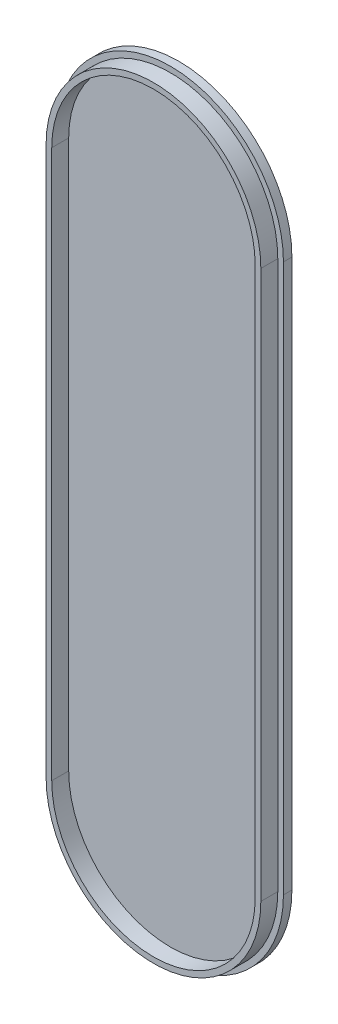
ISO-10303-21;
HEADER;
FILE_DESCRIPTION(('STEP AP214'),'2;1');
FILE_NAME('part.step','',(''),(''),'','','');
FILE_SCHEMA(('AUTOMOTIVE_DESIGN { 1 0 10303 214 1 1 1 1 }'));
ENDSEC;
DATA;
#1=APPLICATION_CONTEXT('core data for automotive mechanical design processes');
#2=APPLICATION_PROTOCOL_DEFINITION('international standard','automotive_design',2000,#1);
#3=PRODUCT_CONTEXT('',#1,'mechanical');
#4=PRODUCT('Part','Part','',(#3));
#5=PRODUCT_RELATED_PRODUCT_CATEGORY('part','',(#4));
#6=PRODUCT_DEFINITION_FORMATION('','',#4);
#7=PRODUCT_DEFINITION_CONTEXT('part definition',#1,'design');
#8=PRODUCT_DEFINITION('design','',#6,#7);
#9=PRODUCT_DEFINITION_SHAPE('','',#8);
#10=(LENGTH_UNIT() NAMED_UNIT(*) SI_UNIT(.MILLI.,.METRE.));
#11=(NAMED_UNIT(*) PLANE_ANGLE_UNIT() SI_UNIT($,.RADIAN.));
#12=(NAMED_UNIT(*) SI_UNIT($,.STERADIAN.) SOLID_ANGLE_UNIT());
#13=UNCERTAINTY_MEASURE_WITH_UNIT(LENGTH_MEASURE(1.E-05),#10,'distance_accuracy_value','');
#14=(GEOMETRIC_REPRESENTATION_CONTEXT(3) GLOBAL_UNCERTAINTY_ASSIGNED_CONTEXT((#13)) GLOBAL_UNIT_ASSIGNED_CONTEXT((#10,
#11,#12)) REPRESENTATION_CONTEXT('',''));
#15=CARTESIAN_POINT('',(0.,0.,0.));
#16=DIRECTION('',(0.,0.,1.));
#17=DIRECTION('',(1.,0.,0.));
#18=AXIS2_PLACEMENT_3D('',#15,#16,#17);
#19=CARTESIAN_POINT('',(0.,0.,1.5));
#20=DIRECTION('',(0.,0.,1.));
#21=DIRECTION('',(1.,0.,0.));
#22=AXIS2_PLACEMENT_3D('',#19,#20,#21);
#23=PLANE('',#22);
#24=CARTESIAN_POINT('',(0.,0.,1.5));
#25=DIRECTION('',(0.,0.,1.));
#26=DIRECTION('',(1.,0.,0.));
#27=AXIS2_PLACEMENT_3D('',#24,#25,#26);
#28=CIRCLE('',#27,20.);
#29=CARTESIAN_POINT('',(20.,0.,1.5));
#30=VERTEX_POINT('',#29);
#31=CARTESIAN_POINT('',(-20.,0.,1.5));
#32=VERTEX_POINT('',#31);
#33=EDGE_CURVE('E198',#30,#32,#28,.T.);
#34=ORIENTED_EDGE('',*,*,#33,.T.);
#35=DIRECTION('',(0.,-1.,0.));
#36=VECTOR('',#35,1.);
#37=CARTESIAN_POINT('',(-20.,0.,1.5));
#38=LINE('',#37,#36);
#39=CARTESIAN_POINT('',(-20.,-97.,1.5));
#40=VERTEX_POINT('',#39);
#41=EDGE_CURVE('E201',#32,#40,#38,.T.);
#42=ORIENTED_EDGE('',*,*,#41,.T.);
#43=CARTESIAN_POINT('',(0.,-97.,1.5));
#44=DIRECTION('',(0.,0.,1.));
#45=DIRECTION('',(1.,0.,0.));
#46=AXIS2_PLACEMENT_3D('',#43,#44,#45);
#47=CIRCLE('',#46,20.);
#48=CARTESIAN_POINT('',(20.,-97.,1.5));
#49=VERTEX_POINT('',#48);
#50=EDGE_CURVE('E204',#40,#49,#47,.T.);
#51=ORIENTED_EDGE('',*,*,#50,.T.);
#52=DIRECTION('',(0.,1.,0.));
#53=VECTOR('',#52,1.);
#54=CARTESIAN_POINT('',(20.,0.,1.5));
#55=LINE('',#54,#53);
#56=EDGE_CURVE('E206',#49,#30,#55,.T.);
#57=ORIENTED_EDGE('',*,*,#56,.T.);
#58=EDGE_LOOP('',(#34,#42,#51,#57));
#59=FACE_BOUND('',#58,.T.);
#60=DIRECTION('',(0.,1.,0.));
#61=VECTOR('',#60,1.);
#62=CARTESIAN_POINT('',(19.,-97.,1.5));
#63=LINE('',#62,#61);
#64=CARTESIAN_POINT('',(19.,-97.,1.5));
#65=VERTEX_POINT('',#64);
#66=CARTESIAN_POINT('',(19.,0.,1.5));
#67=VERTEX_POINT('',#66);
#68=EDGE_CURVE('E184',#65,#67,#63,.T.);
#69=ORIENTED_EDGE('',*,*,#68,.F.);
#70=CARTESIAN_POINT('',(0.,-97.,1.5));
#71=DIRECTION('',(0.,0.,1.));
#72=DIRECTION('',(1.,0.,0.));
#73=AXIS2_PLACEMENT_3D('',#70,#71,#72);
#74=CIRCLE('',#73,19.);
#75=CARTESIAN_POINT('',(-19.,-97.,1.5));
#76=VERTEX_POINT('',#75);
#77=EDGE_CURVE('E149',#76,#65,#74,.T.);
#78=ORIENTED_EDGE('',*,*,#77,.F.);
#79=DIRECTION('',(0.,-1.,0.));
#80=VECTOR('',#79,1.);
#81=CARTESIAN_POINT('',(-19.,0.,1.5));
#82=LINE('',#81,#80);
#83=CARTESIAN_POINT('',(-19.,0.,1.5));
#84=VERTEX_POINT('',#83);
#85=EDGE_CURVE('E175',#84,#76,#82,.T.);
#86=ORIENTED_EDGE('',*,*,#85,.F.);
#87=CARTESIAN_POINT('',(0.,0.,1.5));
#88=DIRECTION('',(0.,0.,1.));
#89=DIRECTION('',(1.,0.,0.));
#90=AXIS2_PLACEMENT_3D('',#87,#88,#89);
#91=CIRCLE('',#90,19.);
#92=EDGE_CURVE('E186',#67,#84,#91,.T.);
#93=ORIENTED_EDGE('',*,*,#92,.F.);
#94=EDGE_LOOP('',(#69,#78,#86,#93));
#95=FACE_BOUND('',#94,.T.);
#96=ADVANCED_FACE('F41',(#59,#95),#23,.T.);
#97=CARTESIAN_POINT('',(0.,0.,1.5));
#98=DIRECTION('',(0.,0.,-1.));
#99=DIRECTION('',(-1.,0.,0.));
#100=AXIS2_PLACEMENT_3D('',#97,#98,#99);
#101=CYLINDRICAL_SURFACE('',#100,20.);
#102=CARTESIAN_POINT('',(0.,0.,0.));
#103=DIRECTION('',(0.,0.,1.));
#104=DIRECTION('',(1.,0.,0.));
#105=AXIS2_PLACEMENT_3D('',#102,#103,#104);
#106=CIRCLE('',#105,20.);
#107=CARTESIAN_POINT('',(20.,0.,0.));
#108=VERTEX_POINT('',#107);
#109=CARTESIAN_POINT('',(-20.,0.,0.));
#110=VERTEX_POINT('',#109);
#111=EDGE_CURVE('E197',#108,#110,#106,.T.);
#112=ORIENTED_EDGE('',*,*,#111,.T.);
#113=DIRECTION('',(0.,0.,-1.));
#114=VECTOR('',#113,1.);
#115=CARTESIAN_POINT('',(-20.,0.,1.5));
#116=LINE('',#115,#114);
#117=EDGE_CURVE('E11',#32,#110,#116,.T.);
#118=ORIENTED_EDGE('',*,*,#117,.F.);
#119=ORIENTED_EDGE('',*,*,#33,.F.);
#120=DIRECTION('',(0.,0.,-1.));
#121=VECTOR('',#120,1.);
#122=CARTESIAN_POINT('',(20.,0.,1.5));
#123=LINE('',#122,#121);
#124=EDGE_CURVE('E208',#30,#108,#123,.T.);
#125=ORIENTED_EDGE('',*,*,#124,.T.);
#126=EDGE_LOOP('',(#112,#118,#119,#125));
#127=FACE_BOUND('',#126,.T.);
#128=ADVANCED_FACE('F43',(#127),#101,.T.);
#129=CARTESIAN_POINT('',(-20.,0.,1.5));
#130=DIRECTION('',(1.,0.,0.));
#131=DIRECTION('',(0.,1.,0.));
#132=AXIS2_PLACEMENT_3D('',#129,#130,#131);
#133=PLANE('',#132);
#134=DIRECTION('',(0.,-1.,0.));
#135=VECTOR('',#134,1.);
#136=CARTESIAN_POINT('',(-20.,0.,0.));
#137=LINE('',#136,#135);
#138=CARTESIAN_POINT('',(-20.,-97.,0.));
#139=VERTEX_POINT('',#138);
#140=EDGE_CURVE('E211',#110,#139,#137,.T.);
#141=ORIENTED_EDGE('',*,*,#140,.T.);
#142=DIRECTION('',(0.,0.,-1.));
#143=VECTOR('',#142,1.);
#144=CARTESIAN_POINT('',(-20.,-97.,1.5));
#145=LINE('',#144,#143);
#146=EDGE_CURVE('E49',#40,#139,#145,.T.);
#147=ORIENTED_EDGE('',*,*,#146,.F.);
#148=ORIENTED_EDGE('',*,*,#41,.F.);
#149=ORIENTED_EDGE('',*,*,#117,.T.);
#150=EDGE_LOOP('',(#141,#147,#148,#149));
#151=FACE_BOUND('',#150,.T.);
#152=ADVANCED_FACE('F241',(#151),#133,.F.);
#153=CARTESIAN_POINT('',(0.,-97.,1.5));
#154=DIRECTION('',(0.,0.,-1.));
#155=DIRECTION('',(-1.,0.,0.));
#156=AXIS2_PLACEMENT_3D('',#153,#154,#155);
#157=CYLINDRICAL_SURFACE('',#156,20.);
#158=CARTESIAN_POINT('',(0.,-97.,0.));
#159=DIRECTION('',(0.,0.,1.));
#160=DIRECTION('',(1.,0.,0.));
#161=AXIS2_PLACEMENT_3D('',#158,#159,#160);
#162=CIRCLE('',#161,20.);
#163=CARTESIAN_POINT('',(20.,-97.,0.));
#164=VERTEX_POINT('',#163);
#165=EDGE_CURVE('E213',#139,#164,#162,.T.);
#166=ORIENTED_EDGE('',*,*,#165,.T.);
#167=DIRECTION('',(0.,0.,-1.));
#168=VECTOR('',#167,1.);
#169=CARTESIAN_POINT('',(20.,-97.,1.5));
#170=LINE('',#169,#168);
#171=EDGE_CURVE('E218',#49,#164,#170,.T.);
#172=ORIENTED_EDGE('',*,*,#171,.F.);
#173=ORIENTED_EDGE('',*,*,#50,.F.);
#174=ORIENTED_EDGE('',*,*,#146,.T.);
#175=EDGE_LOOP('',(#166,#172,#173,#174));
#176=FACE_BOUND('',#175,.T.);
#177=ADVANCED_FACE('F225',(#176),#157,.T.);
#178=CARTESIAN_POINT('',(20.,0.,1.5));
#179=DIRECTION('',(-1.,0.,0.));
#180=DIRECTION('',(0.,-1.,0.));
#181=AXIS2_PLACEMENT_3D('',#178,#179,#180);
#182=PLANE('',#181);
#183=DIRECTION('',(0.,1.,0.));
#184=VECTOR('',#183,1.);
#185=CARTESIAN_POINT('',(20.,0.,0.));
#186=LINE('',#185,#184);
#187=EDGE_CURVE('E202',#164,#108,#186,.T.);
#188=ORIENTED_EDGE('',*,*,#187,.T.);
#189=ORIENTED_EDGE('',*,*,#124,.F.);
#190=ORIENTED_EDGE('',*,*,#56,.F.);
#191=ORIENTED_EDGE('',*,*,#171,.T.);
#192=EDGE_LOOP('',(#188,#189,#190,#191));
#193=FACE_BOUND('',#192,.T.);
#194=ADVANCED_FACE('F234',(#193),#182,.F.);
#195=CARTESIAN_POINT('',(0.,0.,0.));
#196=DIRECTION('',(0.,0.,1.));
#197=DIRECTION('',(1.,0.,0.));
#198=AXIS2_PLACEMENT_3D('',#195,#196,#197);
#199=PLANE('',#198);
#200=ORIENTED_EDGE('',*,*,#111,.F.);
#201=ORIENTED_EDGE('',*,*,#187,.F.);
#202=ORIENTED_EDGE('',*,*,#165,.F.);
#203=ORIENTED_EDGE('',*,*,#140,.F.);
#204=EDGE_LOOP('',(#200,#201,#202,#203));
#205=FACE_BOUND('',#204,.T.);
#206=ADVANCED_FACE('F231',(#205),#199,.F.);
#207=CARTESIAN_POINT('',(0.,-97.,4.5));
#208=DIRECTION('',(0.,0.,1.));
#209=DIRECTION('',(1.,0.,0.));
#210=AXIS2_PLACEMENT_3D('',#207,#208,#209);
#211=PLANE('',#210);
#212=CARTESIAN_POINT('',(0.,-97.,4.5));
#213=DIRECTION('',(0.,0.,1.));
#214=DIRECTION('',(1.,0.,0.));
#215=AXIS2_PLACEMENT_3D('',#212,#213,#214);
#216=CIRCLE('',#215,19.);
#217=CARTESIAN_POINT('',(-19.,-97.,4.5));
#218=VERTEX_POINT('',#217);
#219=CARTESIAN_POINT('',(19.,-97.,4.5));
#220=VERTEX_POINT('',#219);
#221=EDGE_CURVE('E171',#218,#220,#216,.T.);
#222=ORIENTED_EDGE('',*,*,#221,.T.);
#223=DIRECTION('',(0.,1.,0.));
#224=VECTOR('',#223,1.);
#225=CARTESIAN_POINT('',(19.,-97.,4.5));
#226=LINE('',#225,#224);
#227=CARTESIAN_POINT('',(19.,0.,4.5));
#228=VERTEX_POINT('',#227);
#229=EDGE_CURVE('E174',#220,#228,#226,.T.);
#230=ORIENTED_EDGE('',*,*,#229,.T.);
#231=CARTESIAN_POINT('',(0.,0.,4.5));
#232=DIRECTION('',(0.,0.,1.));
#233=DIRECTION('',(1.,0.,0.));
#234=AXIS2_PLACEMENT_3D('',#231,#232,#233);
#235=CIRCLE('',#234,19.);
#236=CARTESIAN_POINT('',(-19.,0.,4.5));
#237=VERTEX_POINT('',#236);
#238=EDGE_CURVE('E177',#228,#237,#235,.T.);
#239=ORIENTED_EDGE('',*,*,#238,.T.);
#240=DIRECTION('',(0.,-1.,0.));
#241=VECTOR('',#240,1.);
#242=CARTESIAN_POINT('',(-19.,0.,4.5));
#243=LINE('',#242,#241);
#244=EDGE_CURVE('E179',#237,#218,#243,.T.);
#245=ORIENTED_EDGE('',*,*,#244,.T.);
#246=EDGE_LOOP('',(#222,#230,#239,#245));
#247=FACE_BOUND('',#246,.T.);
#248=DIRECTION('',(0.,-1.,0.));
#249=VECTOR('',#248,1.);
#250=CARTESIAN_POINT('',(-18.,0.,4.5));
#251=LINE('',#250,#249);
#252=CARTESIAN_POINT('',(-18.,0.,4.5));
#253=VERTEX_POINT('',#252);
#254=CARTESIAN_POINT('',(-18.,-97.,4.5));
#255=VERTEX_POINT('',#254);
#256=EDGE_CURVE('E141',#253,#255,#251,.T.);
#257=ORIENTED_EDGE('',*,*,#256,.F.);
#258=CARTESIAN_POINT('',(0.,0.,4.5));
#259=DIRECTION('',(0.,0.,1.));
#260=DIRECTION('',(1.,0.,0.));
#261=AXIS2_PLACEMENT_3D('',#258,#259,#260);
#262=CIRCLE('',#261,18.);
#263=CARTESIAN_POINT('',(18.,0.,4.5));
#264=VERTEX_POINT('',#263);
#265=EDGE_CURVE('E132',#264,#253,#262,.T.);
#266=ORIENTED_EDGE('',*,*,#265,.F.);
#267=DIRECTION('',(0.,1.,0.));
#268=VECTOR('',#267,1.);
#269=CARTESIAN_POINT('',(18.,-97.,4.5));
#270=LINE('',#269,#268);
#271=CARTESIAN_POINT('',(18.,-97.,4.5));
#272=VERTEX_POINT('',#271);
#273=EDGE_CURVE('E157',#272,#264,#270,.T.);
#274=ORIENTED_EDGE('',*,*,#273,.F.);
#275=CARTESIAN_POINT('',(0.,-97.,4.5));
#276=DIRECTION('',(0.,0.,1.));
#277=DIRECTION('',(1.,0.,0.));
#278=AXIS2_PLACEMENT_3D('',#275,#276,#277);
#279=CIRCLE('',#278,18.);
#280=EDGE_CURVE('E155',#255,#272,#279,.T.);
#281=ORIENTED_EDGE('',*,*,#280,.F.);
#282=EDGE_LOOP('',(#257,#266,#274,#281));
#283=FACE_BOUND('',#282,.T.);
#284=ADVANCED_FACE('F153',(#247,#283),#211,.T.);
#285=CARTESIAN_POINT('',(0.,-97.,4.5));
#286=DIRECTION('',(0.,0.,-1.));
#287=DIRECTION('',(-1.,0.,0.));
#288=AXIS2_PLACEMENT_3D('',#285,#286,#287);
#289=CYLINDRICAL_SURFACE('',#288,19.);
#290=ORIENTED_EDGE('',*,*,#77,.T.);
#291=DIRECTION('',(0.,0.,-1.));
#292=VECTOR('',#291,1.);
#293=CARTESIAN_POINT('',(19.,-97.,4.5));
#294=LINE('',#293,#292);
#295=EDGE_CURVE('E195',#220,#65,#294,.T.);
#296=ORIENTED_EDGE('',*,*,#295,.F.);
#297=ORIENTED_EDGE('',*,*,#221,.F.);
#298=DIRECTION('',(0.,0.,-1.));
#299=VECTOR('',#298,1.);
#300=CARTESIAN_POINT('',(-19.,-97.,4.5));
#301=LINE('',#300,#299);
#302=EDGE_CURVE('E181',#218,#76,#301,.T.);
#303=ORIENTED_EDGE('',*,*,#302,.T.);
#304=EDGE_LOOP('',(#290,#296,#297,#303));
#305=FACE_BOUND('',#304,.T.);
#306=ADVANCED_FACE('F278',(#305),#289,.T.);
#307=CARTESIAN_POINT('',(19.,-97.,4.5));
#308=DIRECTION('',(-1.,0.,0.));
#309=DIRECTION('',(0.,-1.,0.));
#310=AXIS2_PLACEMENT_3D('',#307,#308,#309);
#311=PLANE('',#310);
#312=ORIENTED_EDGE('',*,*,#68,.T.);
#313=DIRECTION('',(0.,0.,-1.));
#314=VECTOR('',#313,1.);
#315=CARTESIAN_POINT('',(19.,0.,4.5));
#316=LINE('',#315,#314);
#317=EDGE_CURVE('E192',#228,#67,#316,.T.);
#318=ORIENTED_EDGE('',*,*,#317,.F.);
#319=ORIENTED_EDGE('',*,*,#229,.F.);
#320=ORIENTED_EDGE('',*,*,#295,.T.);
#321=EDGE_LOOP('',(#312,#318,#319,#320));
#322=FACE_BOUND('',#321,.T.);
#323=ADVANCED_FACE('F285',(#322),#311,.F.);
#324=CARTESIAN_POINT('',(0.,0.,4.5));
#325=DIRECTION('',(0.,0.,-1.));
#326=DIRECTION('',(-1.,0.,0.));
#327=AXIS2_PLACEMENT_3D('',#324,#325,#326);
#328=CYLINDRICAL_SURFACE('',#327,19.);
#329=ORIENTED_EDGE('',*,*,#92,.T.);
#330=DIRECTION('',(0.,0.,-1.));
#331=VECTOR('',#330,1.);
#332=CARTESIAN_POINT('',(-19.,0.,4.5));
#333=LINE('',#332,#331);
#334=EDGE_CURVE('E56',#237,#84,#333,.T.);
#335=ORIENTED_EDGE('',*,*,#334,.F.);
#336=ORIENTED_EDGE('',*,*,#238,.F.);
#337=ORIENTED_EDGE('',*,*,#317,.T.);
#338=EDGE_LOOP('',(#329,#335,#336,#337));
#339=FACE_BOUND('',#338,.T.);
#340=ADVANCED_FACE('F282',(#339),#328,.T.);
#341=CARTESIAN_POINT('',(-19.,0.,4.5));
#342=DIRECTION('',(1.,0.,0.));
#343=DIRECTION('',(0.,1.,0.));
#344=AXIS2_PLACEMENT_3D('',#341,#342,#343);
#345=PLANE('',#344);
#346=ORIENTED_EDGE('',*,*,#85,.T.);
#347=ORIENTED_EDGE('',*,*,#302,.F.);
#348=ORIENTED_EDGE('',*,*,#244,.F.);
#349=ORIENTED_EDGE('',*,*,#334,.T.);
#350=EDGE_LOOP('',(#346,#347,#348,#349));
#351=FACE_BOUND('',#350,.T.);
#352=ADVANCED_FACE('F276',(#351),#345,.F.);
#353=CARTESIAN_POINT('',(0.,0.,4.5));
#354=DIRECTION('',(0.,0.,-1.));
#355=DIRECTION('',(-1.,0.,0.));
#356=AXIS2_PLACEMENT_3D('',#353,#354,#355);
#357=CYLINDRICAL_SURFACE('',#356,18.);
#358=CARTESIAN_POINT('',(0.,0.,1.5));
#359=DIRECTION('',(0.,0.,1.));
#360=DIRECTION('',(1.,0.,0.));
#361=AXIS2_PLACEMENT_3D('',#358,#359,#360);
#362=CIRCLE('',#361,18.);
#363=CARTESIAN_POINT('',(18.,0.,1.5));
#364=VERTEX_POINT('',#363);
#365=CARTESIAN_POINT('',(-18.,0.,1.5));
#366=VERTEX_POINT('',#365);
#367=EDGE_CURVE('E64',#364,#366,#362,.T.);
#368=ORIENTED_EDGE('',*,*,#367,.F.);
#369=DIRECTION('',(0.,0.,-1.));
#370=VECTOR('',#369,1.);
#371=CARTESIAN_POINT('',(18.,0.,4.5));
#372=LINE('',#371,#370);
#373=EDGE_CURVE('E137',#264,#364,#372,.T.);
#374=ORIENTED_EDGE('',*,*,#373,.F.);
#375=ORIENTED_EDGE('',*,*,#265,.T.);
#376=DIRECTION('',(0.,0.,-1.));
#377=VECTOR('',#376,1.);
#378=CARTESIAN_POINT('',(-18.,0.,4.5));
#379=LINE('',#378,#377);
#380=EDGE_CURVE('E135',#253,#366,#379,.T.);
#381=ORIENTED_EDGE('',*,*,#380,.T.);
#382=EDGE_LOOP('',(#368,#374,#375,#381));
#383=FACE_BOUND('',#382,.T.);
#384=ADVANCED_FACE('F134',(#383),#357,.F.);
#385=CARTESIAN_POINT('',(-18.,0.,4.5));
#386=DIRECTION('',(1.,0.,0.));
#387=DIRECTION('',(0.,1.,0.));
#388=AXIS2_PLACEMENT_3D('',#385,#386,#387);
#389=PLANE('',#388);
#390=DIRECTION('',(0.,-1.,0.));
#391=VECTOR('',#390,1.);
#392=CARTESIAN_POINT('',(-18.,0.,1.5));
#393=LINE('',#392,#391);
#394=CARTESIAN_POINT('',(-18.,-97.,1.5));
#395=VERTEX_POINT('',#394);
#396=EDGE_CURVE('E148',#366,#395,#393,.T.);
#397=ORIENTED_EDGE('',*,*,#396,.F.);
#398=ORIENTED_EDGE('',*,*,#380,.F.);
#399=ORIENTED_EDGE('',*,*,#256,.T.);
#400=DIRECTION('',(0.,0.,-1.));
#401=VECTOR('',#400,1.);
#402=CARTESIAN_POINT('',(-18.,-97.,4.5));
#403=LINE('',#402,#401);
#404=EDGE_CURVE('E150',#255,#395,#403,.T.);
#405=ORIENTED_EDGE('',*,*,#404,.T.);
#406=EDGE_LOOP('',(#397,#398,#399,#405));
#407=FACE_BOUND('',#406,.T.);
#408=ADVANCED_FACE('F145',(#407),#389,.T.);
#409=CARTESIAN_POINT('',(0.,-97.,4.5));
#410=DIRECTION('',(0.,0.,-1.));
#411=DIRECTION('',(-1.,0.,0.));
#412=AXIS2_PLACEMENT_3D('',#409,#410,#411);
#413=CYLINDRICAL_SURFACE('',#412,18.);
#414=CARTESIAN_POINT('',(0.,-97.,1.5));
#415=DIRECTION('',(0.,0.,1.));
#416=DIRECTION('',(1.,0.,0.));
#417=AXIS2_PLACEMENT_3D('',#414,#415,#416);
#418=CIRCLE('',#417,18.);
#419=CARTESIAN_POINT('',(18.,-97.,1.5));
#420=VERTEX_POINT('',#419);
#421=EDGE_CURVE('E163',#395,#420,#418,.T.);
#422=ORIENTED_EDGE('',*,*,#421,.F.);
#423=ORIENTED_EDGE('',*,*,#404,.F.);
#424=ORIENTED_EDGE('',*,*,#280,.T.);
#425=DIRECTION('',(0.,0.,-1.));
#426=VECTOR('',#425,1.);
#427=CARTESIAN_POINT('',(18.,-97.,4.5));
#428=LINE('',#427,#426);
#429=EDGE_CURVE('E167',#272,#420,#428,.T.);
#430=ORIENTED_EDGE('',*,*,#429,.T.);
#431=EDGE_LOOP('',(#422,#423,#424,#430));
#432=FACE_BOUND('',#431,.T.);
#433=ADVANCED_FACE('F262',(#432),#413,.F.);
#434=CARTESIAN_POINT('',(18.,-97.,4.5));
#435=DIRECTION('',(-1.,0.,0.));
#436=DIRECTION('',(0.,-1.,0.));
#437=AXIS2_PLACEMENT_3D('',#434,#435,#436);
#438=PLANE('',#437);
#439=DIRECTION('',(0.,1.,0.));
#440=VECTOR('',#439,1.);
#441=CARTESIAN_POINT('',(18.,-97.,1.5));
#442=LINE('',#441,#440);
#443=EDGE_CURVE('E142',#420,#364,#442,.T.);
#444=ORIENTED_EDGE('',*,*,#443,.F.);
#445=ORIENTED_EDGE('',*,*,#429,.F.);
#446=ORIENTED_EDGE('',*,*,#273,.T.);
#447=ORIENTED_EDGE('',*,*,#373,.T.);
#448=EDGE_LOOP('',(#444,#445,#446,#447));
#449=FACE_BOUND('',#448,.T.);
#450=ADVANCED_FACE('F258',(#449),#438,.T.);
#451=ORIENTED_EDGE('',*,*,#367,.T.);
#452=ORIENTED_EDGE('',*,*,#396,.T.);
#453=ORIENTED_EDGE('',*,*,#421,.T.);
#454=ORIENTED_EDGE('',*,*,#443,.T.);
#455=EDGE_LOOP('',(#451,#452,#453,#454));
#456=FACE_BOUND('',#455,.T.);
#457=ADVANCED_FACE('F250',(#456),#23,.T.);
#458=CLOSED_SHELL('',(#96,#128,#152,#177,#194,#206,#284,#306,#323,#340,#352,#384,#408,#433,#450,#457));
#459=MANIFOLD_SOLID_BREP('B2',#458);
#460=ADVANCED_BREP_SHAPE_REPRESENTATION('',(#18,#459),#14);
#461=SHAPE_DEFINITION_REPRESENTATION(#9,#460);
ENDSEC;
END-ISO-10303-21;
